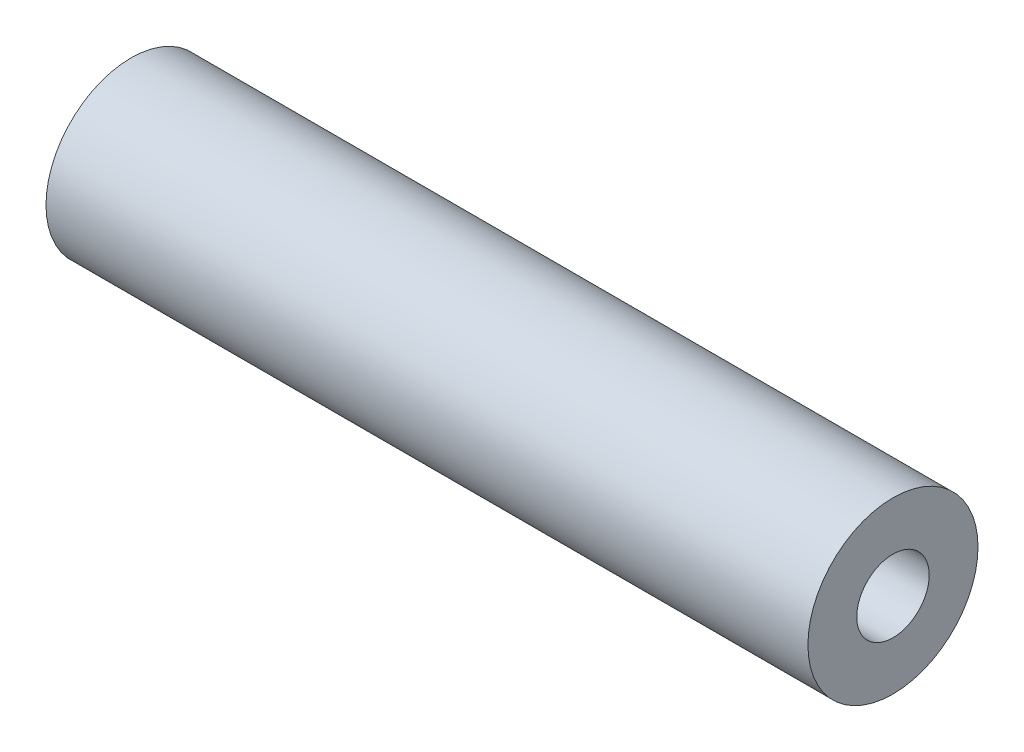
ISO-10303-21;
HEADER;
FILE_DESCRIPTION(('STEP AP214'),'2;1');
FILE_NAME('part.step','',(''),(''),'','','');
FILE_SCHEMA(('AUTOMOTIVE_DESIGN { 1 0 10303 214 1 1 1 1 }'));
ENDSEC;
DATA;
#1=APPLICATION_CONTEXT('core data for automotive mechanical design processes');
#2=APPLICATION_PROTOCOL_DEFINITION('international standard','automotive_design',2000,#1);
#3=PRODUCT_CONTEXT('',#1,'mechanical');
#4=PRODUCT('Part','Part','',(#3));
#5=PRODUCT_RELATED_PRODUCT_CATEGORY('part','',(#4));
#6=PRODUCT_DEFINITION_FORMATION('','',#4);
#7=PRODUCT_DEFINITION_CONTEXT('part definition',#1,'design');
#8=PRODUCT_DEFINITION('design','',#6,#7);
#9=PRODUCT_DEFINITION_SHAPE('','',#8);
#10=(LENGTH_UNIT() NAMED_UNIT(*) SI_UNIT(.MILLI.,.METRE.));
#11=(NAMED_UNIT(*) PLANE_ANGLE_UNIT() SI_UNIT($,.RADIAN.));
#12=(NAMED_UNIT(*) SI_UNIT($,.STERADIAN.) SOLID_ANGLE_UNIT());
#13=UNCERTAINTY_MEASURE_WITH_UNIT(LENGTH_MEASURE(1.E-05),#10,'distance_accuracy_value','');
#14=(GEOMETRIC_REPRESENTATION_CONTEXT(3) GLOBAL_UNCERTAINTY_ASSIGNED_CONTEXT((#13)) GLOBAL_UNIT_ASSIGNED_CONTEXT((#10,
#11,#12)) REPRESENTATION_CONTEXT('',''));
#15=CARTESIAN_POINT('',(0.,0.,0.));
#16=DIRECTION('',(0.,0.,1.));
#17=DIRECTION('',(1.,0.,0.));
#18=AXIS2_PLACEMENT_3D('',#15,#16,#17);
#19=CARTESIAN_POINT('',(28.448,0.,0.));
#20=DIRECTION('',(-1.,0.,0.));
#21=DIRECTION('',(0.,0.,1.));
#22=AXIS2_PLACEMENT_3D('',#19,#20,#21);
#23=CYLINDRICAL_SURFACE('',#22,3.175);
#24=CARTESIAN_POINT('',(28.448,0.,0.));
#25=DIRECTION('',(1.,0.,0.));
#26=DIRECTION('',(0.,0.,-1.));
#27=AXIS2_PLACEMENT_3D('',#24,#25,#26);
#28=CIRCLE('',#27,3.175);
#29=CARTESIAN_POINT('',(28.448,0.,-3.175));
#30=VERTEX_POINT('',#29);
#31=EDGE_CURVE('E10',#30,#30,#28,.T.);
#32=ORIENTED_EDGE('',*,*,#31,.F.);
#33=EDGE_LOOP('',(#32));
#34=FACE_BOUND('',#33,.T.);
#35=CARTESIAN_POINT('',(0.,0.,0.));
#36=DIRECTION('',(1.,0.,0.));
#37=DIRECTION('',(0.,0.,-1.));
#38=AXIS2_PLACEMENT_3D('',#35,#36,#37);
#39=CIRCLE('',#38,3.175);
#40=CARTESIAN_POINT('',(0.,0.,-3.175));
#41=VERTEX_POINT('',#40);
#42=EDGE_CURVE('E36',#41,#41,#39,.T.);
#43=ORIENTED_EDGE('',*,*,#42,.T.);
#44=EDGE_LOOP('',(#43));
#45=FACE_BOUND('',#44,.T.);
#46=ADVANCED_FACE('F33',(#34,#45),#23,.T.);
#47=CARTESIAN_POINT('',(28.448,0.,0.));
#48=DIRECTION('',(1.,0.,0.));
#49=DIRECTION('',(0.,0.,-1.));
#50=AXIS2_PLACEMENT_3D('',#47,#48,#49);
#51=PLANE('',#50);
#52=CARTESIAN_POINT('',(28.448,0.,0.));
#53=DIRECTION('',(1.,0.,0.));
#54=DIRECTION('',(0.,0.,-1.));
#55=AXIS2_PLACEMENT_3D('',#52,#53,#54);
#56=CIRCLE('',#55,1.35254999999999);
#57=CARTESIAN_POINT('',(28.448,0.,-1.35254999999999));
#58=VERTEX_POINT('',#57);
#59=EDGE_CURVE('E47',#58,#58,#56,.T.);
#60=ORIENTED_EDGE('',*,*,#59,.F.);
#61=EDGE_LOOP('',(#60));
#62=FACE_BOUND('',#61,.T.);
#63=ORIENTED_EDGE('',*,*,#31,.T.);
#64=EDGE_LOOP('',(#63));
#65=FACE_BOUND('',#64,.T.);
#66=ADVANCED_FACE('F53',(#62,#65),#51,.T.);
#67=CARTESIAN_POINT('',(0.,0.,0.));
#68=DIRECTION('',(1.,0.,0.));
#69=DIRECTION('',(0.,0.,-1.));
#70=AXIS2_PLACEMENT_3D('',#67,#68,#69);
#71=PLANE('',#70);
#72=CARTESIAN_POINT('',(0.,0.,0.));
#73=DIRECTION('',(1.,0.,0.));
#74=DIRECTION('',(0.,0.,-1.));
#75=AXIS2_PLACEMENT_3D('',#72,#73,#74);
#76=CIRCLE('',#75,1.35255);
#77=CARTESIAN_POINT('',(0.,0.,-1.35255));
#78=VERTEX_POINT('',#77);
#79=EDGE_CURVE('E43',#78,#78,#76,.T.);
#80=ORIENTED_EDGE('',*,*,#79,.T.);
#81=EDGE_LOOP('',(#80));
#82=FACE_BOUND('',#81,.T.);
#83=ORIENTED_EDGE('',*,*,#42,.F.);
#84=EDGE_LOOP('',(#83));
#85=FACE_BOUND('',#84,.T.);
#86=ADVANCED_FACE('F55',(#82,#85),#71,.F.);
#87=CARTESIAN_POINT('',(28.448,0.,0.));
#88=DIRECTION('',(1.,0.,0.));
#89=DIRECTION('',(0.,0.,-1.));
#90=AXIS2_PLACEMENT_3D('',#87,#88,#89);
#91=CYLINDRICAL_SURFACE('',#90,1.35254999999999);
#92=ORIENTED_EDGE('',*,*,#79,.F.);
#93=EDGE_LOOP('',(#92));
#94=FACE_BOUND('',#93,.T.);
#95=ORIENTED_EDGE('',*,*,#59,.T.);
#96=EDGE_LOOP('',(#95));
#97=FACE_BOUND('',#96,.T.);
#98=ADVANCED_FACE('F51',(#94,#97),#91,.F.);
#99=CLOSED_SHELL('',(#46,#66,#86,#98));
#100=MANIFOLD_SOLID_BREP('B2',#99);
#101=ADVANCED_BREP_SHAPE_REPRESENTATION('',(#18,#100),#14);
#102=SHAPE_DEFINITION_REPRESENTATION(#9,#101);
ENDSEC;
END-ISO-10303-21;
